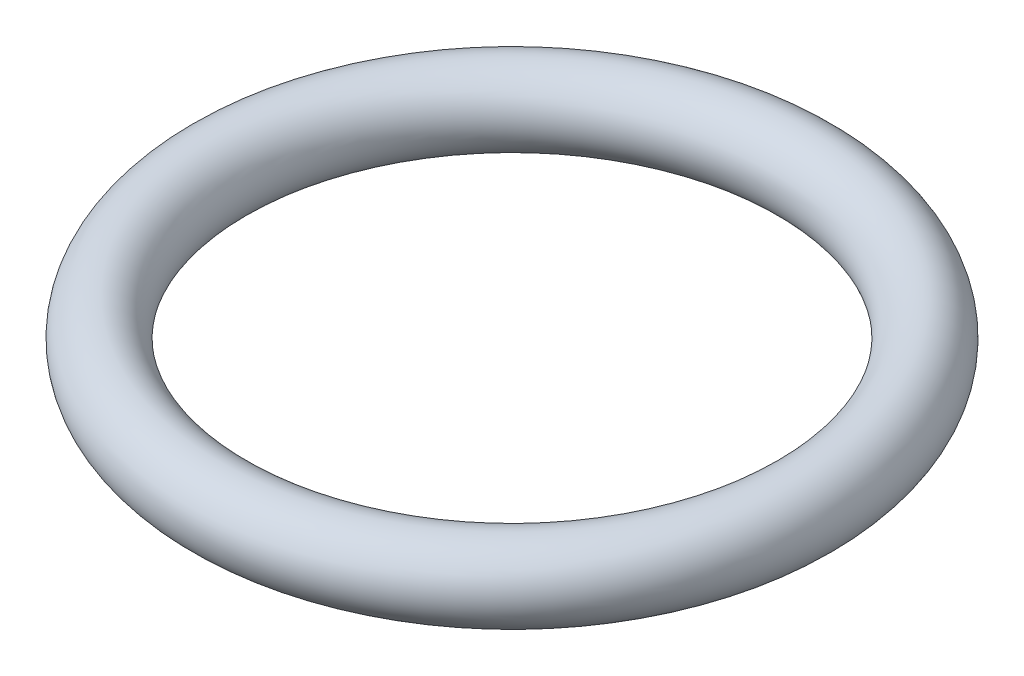
ISO-10303-21;
HEADER;
FILE_DESCRIPTION(('STEP AP214'),'2;1');
FILE_NAME('part.step','',(''),(''),'','','');
FILE_SCHEMA(('AUTOMOTIVE_DESIGN { 1 0 10303 214 1 1 1 1 }'));
ENDSEC;
DATA;
#1=APPLICATION_CONTEXT('core data for automotive mechanical design processes');
#2=APPLICATION_PROTOCOL_DEFINITION('international standard','automotive_design',2000,#1);
#3=PRODUCT_CONTEXT('',#1,'mechanical');
#4=PRODUCT('Part','Part','',(#3));
#5=PRODUCT_RELATED_PRODUCT_CATEGORY('part','',(#4));
#6=PRODUCT_DEFINITION_FORMATION('','',#4);
#7=PRODUCT_DEFINITION_CONTEXT('part definition',#1,'design');
#8=PRODUCT_DEFINITION('design','',#6,#7);
#9=PRODUCT_DEFINITION_SHAPE('','',#8);
#10=(LENGTH_UNIT() NAMED_UNIT(*) SI_UNIT(.MILLI.,.METRE.));
#11=(NAMED_UNIT(*) PLANE_ANGLE_UNIT() SI_UNIT($,.RADIAN.));
#12=(NAMED_UNIT(*) SI_UNIT($,.STERADIAN.) SOLID_ANGLE_UNIT());
#13=UNCERTAINTY_MEASURE_WITH_UNIT(LENGTH_MEASURE(1.E-05),#10,'distance_accuracy_value','');
#14=(GEOMETRIC_REPRESENTATION_CONTEXT(3) GLOBAL_UNCERTAINTY_ASSIGNED_CONTEXT((#13)) GLOBAL_UNIT_ASSIGNED_CONTEXT((#10,
#11,#12)) REPRESENTATION_CONTEXT('',''));
#15=CARTESIAN_POINT('',(0.,0.,0.));
#16=DIRECTION('',(0.,0.,1.));
#17=DIRECTION('',(1.,0.,0.));
#18=AXIS2_PLACEMENT_3D('',#15,#16,#17);
#19=CARTESIAN_POINT('',(0.,0.,0.));
#20=DIRECTION('',(0.,1.,0.));
#21=DIRECTION('',(-1.,0.,0.));
#22=AXIS2_PLACEMENT_3D('',#19,#20,#21);
#23=TOROIDAL_SURFACE('',#22,5.45,0.7);
#24=CARTESIAN_POINT('',(-6.15,0.,0.));
#25=VERTEX_POINT('',#24);
#26=VERTEX_LOOP('',#25);
#27=FACE_BOUND('',#26,.T.);
#28=ADVANCED_FACE('F28',(#27),#23,.T.);
#29=CLOSED_SHELL('',(#28));
#30=MANIFOLD_SOLID_BREP('B2',#29);
#31=ADVANCED_BREP_SHAPE_REPRESENTATION('',(#18,#30),#14);
#32=SHAPE_DEFINITION_REPRESENTATION(#9,#31);
ENDSEC;
END-ISO-10303-21;
